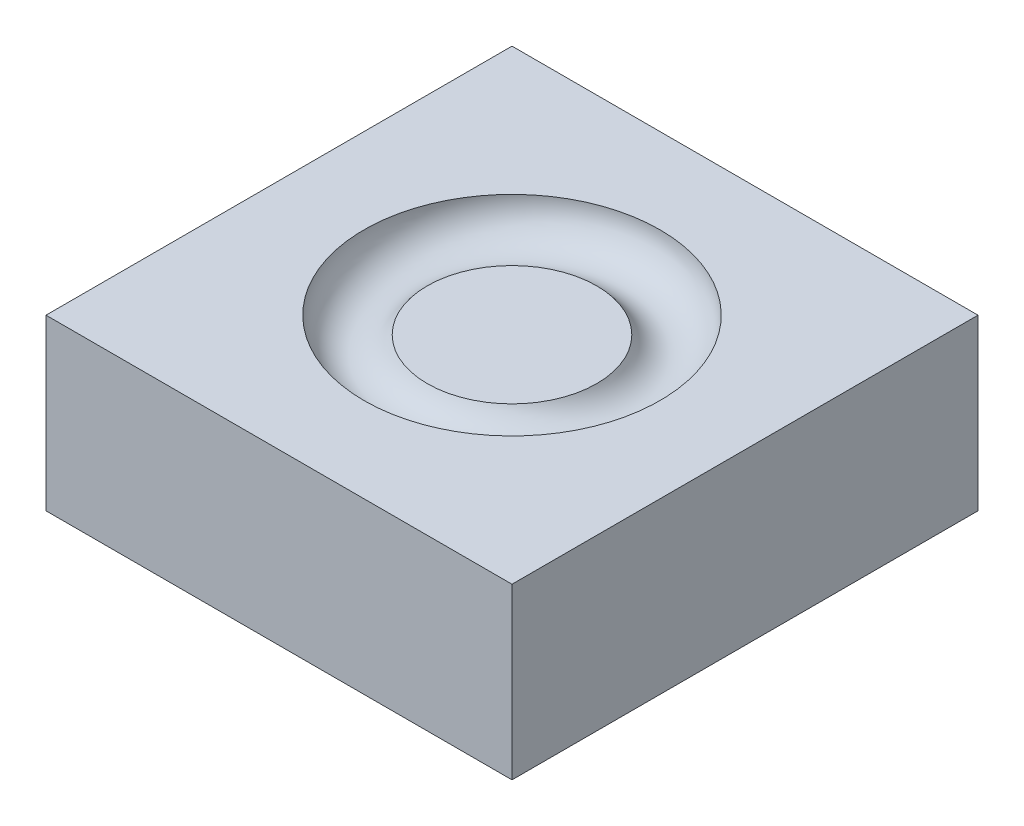
ISO-10303-21;
HEADER;
FILE_DESCRIPTION(('STEP AP214'),'2;1');
FILE_NAME('part.step','',(''),(''),'','','');
FILE_SCHEMA(('AUTOMOTIVE_DESIGN { 1 0 10303 214 1 1 1 1 }'));
ENDSEC;
DATA;
#1=APPLICATION_CONTEXT('core data for automotive mechanical design processes');
#2=APPLICATION_PROTOCOL_DEFINITION('international standard','automotive_design',2000,#1);
#3=PRODUCT_CONTEXT('',#1,'mechanical');
#4=PRODUCT('Part','Part','',(#3));
#5=PRODUCT_RELATED_PRODUCT_CATEGORY('part','',(#4));
#6=PRODUCT_DEFINITION_FORMATION('','',#4);
#7=PRODUCT_DEFINITION_CONTEXT('part definition',#1,'design');
#8=PRODUCT_DEFINITION('design','',#6,#7);
#9=PRODUCT_DEFINITION_SHAPE('','',#8);
#10=(LENGTH_UNIT() NAMED_UNIT(*) SI_UNIT(.MILLI.,.METRE.));
#11=(NAMED_UNIT(*) PLANE_ANGLE_UNIT() SI_UNIT($,.RADIAN.));
#12=(NAMED_UNIT(*) SI_UNIT($,.STERADIAN.) SOLID_ANGLE_UNIT());
#13=UNCERTAINTY_MEASURE_WITH_UNIT(LENGTH_MEASURE(1.E-05),#10,'distance_accuracy_value','');
#14=(GEOMETRIC_REPRESENTATION_CONTEXT(3) GLOBAL_UNCERTAINTY_ASSIGNED_CONTEXT((#13)) GLOBAL_UNIT_ASSIGNED_CONTEXT((#10,
#11,#12)) REPRESENTATION_CONTEXT('',''));
#15=CARTESIAN_POINT('',(0.,0.,0.));
#16=DIRECTION('',(0.,0.,1.));
#17=DIRECTION('',(1.,0.,0.));
#18=AXIS2_PLACEMENT_3D('',#15,#16,#17);
#19=CARTESIAN_POINT('',(0.,0.,0.));
#20=DIRECTION('',(0.,1.,0.));
#21=DIRECTION('',(0.,0.,1.));
#22=AXIS2_PLACEMENT_3D('',#19,#20,#21);
#23=PLANE('',#22);
#24=CARTESIAN_POINT('',(0.,0.,0.));
#25=DIRECTION('',(0.,-1.,0.));
#26=DIRECTION('',(0.,0.,-1.));
#27=AXIS2_PLACEMENT_3D('',#24,#25,#26);
#28=CIRCLE('',#27,20.);
#29=CARTESIAN_POINT('',(0.,0.,-20.));
#30=VERTEX_POINT('',#29);
#31=EDGE_CURVE('E124',#30,#30,#28,.T.);
#32=ORIENTED_EDGE('',*,*,#31,.F.);
#33=EDGE_LOOP('',(#32));
#34=FACE_BOUND('',#33,.T.);
#35=ADVANCED_FACE('F46',(#34),#23,.T.);
#36=CARTESIAN_POINT('',(0.,4.,0.));
#37=DIRECTION('',(0.,-1.,0.));
#38=DIRECTION('',(0.,0.,-1.));
#39=AXIS2_PLACEMENT_3D('',#36,#37,#38);
#40=TOROIDAL_SURFACE('',#39,26.9282032302755,8.);
#41=ORIENTED_EDGE('',*,*,#31,.T.);
#42=EDGE_LOOP('',(#41));
#43=FACE_BOUND('',#42,.T.);
#44=CARTESIAN_POINT('',(0.,4.,0.));
#45=DIRECTION('',(0.,-1.,0.));
#46=DIRECTION('',(0.,0.,-1.));
#47=AXIS2_PLACEMENT_3D('',#44,#45,#46);
#48=CIRCLE('',#47,34.9282032302755);
#49=CARTESIAN_POINT('',(0.,4.,-34.9282032302755));
#50=VERTEX_POINT('',#49);
#51=EDGE_CURVE('E117',#50,#50,#48,.T.);
#52=ORIENTED_EDGE('',*,*,#51,.F.);
#53=EDGE_LOOP('',(#52));
#54=FACE_BOUND('',#53,.T.);
#55=ADVANCED_FACE('F153',(#43,#54),#40,.F.);
#56=CARTESIAN_POINT('',(-0.725366670454234,4.,-34.9282043037022));
#57=DIRECTION('',(0.,1.,0.));
#58=DIRECTION('',(0.999999999998905,0.,1.47984011281865E-06));
#59=AXIS2_PLACEMENT_3D('',#56,#57,#58);
#60=PLANE('',#59);
#61=DIRECTION('',(0.,0.,1.));
#62=VECTOR('',#61,1.);
#63=CARTESIAN_POINT('',(55.,4.,-55.));
#64=LINE('',#63,#62);
#65=CARTESIAN_POINT('',(55.,4.,-55.));
#66=VERTEX_POINT('',#65);
#67=CARTESIAN_POINT('',(55.,3.99999999999999,55.));
#68=VERTEX_POINT('',#67);
#69=EDGE_CURVE('E58',#66,#68,#64,.T.);
#70=ORIENTED_EDGE('',*,*,#69,.F.);
#71=DIRECTION('',(1.,0.,0.));
#72=VECTOR('',#71,1.);
#73=CARTESIAN_POINT('',(-55.,4.,-55.));
#74=LINE('',#73,#72);
#75=CARTESIAN_POINT('',(-55.,4.,-55.));
#76=VERTEX_POINT('',#75);
#77=EDGE_CURVE('E81',#76,#66,#74,.T.);
#78=ORIENTED_EDGE('',*,*,#77,.F.);
#79=DIRECTION('',(0.,0.,-1.));
#80=VECTOR('',#79,1.);
#81=CARTESIAN_POINT('',(-55.,4.,-55.));
#82=LINE('',#81,#80);
#83=CARTESIAN_POINT('',(-55.,3.99999999999999,55.));
#84=VERTEX_POINT('',#83);
#85=EDGE_CURVE('E86',#84,#76,#82,.T.);
#86=ORIENTED_EDGE('',*,*,#85,.F.);
#87=DIRECTION('',(-1.,0.,0.));
#88=VECTOR('',#87,1.);
#89=CARTESIAN_POINT('',(-55.,3.99999999999999,55.));
#90=LINE('',#89,#88);
#91=EDGE_CURVE('E101',#68,#84,#90,.T.);
#92=ORIENTED_EDGE('',*,*,#91,.F.);
#93=EDGE_LOOP('',(#70,#78,#86,#92));
#94=FACE_BOUND('',#93,.T.);
#95=ORIENTED_EDGE('',*,*,#51,.T.);
#96=EDGE_LOOP('',(#95));
#97=FACE_BOUND('',#96,.T.);
#98=ADVANCED_FACE('F48',(#94,#97),#60,.T.);
#99=CARTESIAN_POINT('',(0.,-36.,0.));
#100=DIRECTION('',(0.,1.,0.));
#101=DIRECTION('',(0.,0.,1.));
#102=AXIS2_PLACEMENT_3D('',#99,#100,#101);
#103=PLANE('',#102);
#104=DIRECTION('',(0.,0.,1.));
#105=VECTOR('',#104,1.);
#106=CARTESIAN_POINT('',(55.,-36.,-55.));
#107=LINE('',#106,#105);
#108=CARTESIAN_POINT('',(55.,-36.,-55.));
#109=VERTEX_POINT('',#108);
#110=CARTESIAN_POINT('',(55.,-36.,55.));
#111=VERTEX_POINT('',#110);
#112=EDGE_CURVE('E113',#109,#111,#107,.T.);
#113=ORIENTED_EDGE('',*,*,#112,.T.);
#114=DIRECTION('',(-1.,0.,0.));
#115=VECTOR('',#114,1.);
#116=CARTESIAN_POINT('',(-55.,-36.,55.));
#117=LINE('',#116,#115);
#118=CARTESIAN_POINT('',(-55.,-36.,55.));
#119=VERTEX_POINT('',#118);
#120=EDGE_CURVE('E99',#111,#119,#117,.T.);
#121=ORIENTED_EDGE('',*,*,#120,.T.);
#122=DIRECTION('',(0.,0.,-1.));
#123=VECTOR('',#122,1.);
#124=CARTESIAN_POINT('',(-55.,-36.,-55.));
#125=LINE('',#124,#123);
#126=CARTESIAN_POINT('',(-55.,-36.,-55.));
#127=VERTEX_POINT('',#126);
#128=EDGE_CURVE('E104',#119,#127,#125,.T.);
#129=ORIENTED_EDGE('',*,*,#128,.T.);
#130=DIRECTION('',(1.,0.,0.));
#131=VECTOR('',#130,1.);
#132=CARTESIAN_POINT('',(-55.,-36.,-55.));
#133=LINE('',#132,#131);
#134=EDGE_CURVE('E110',#127,#109,#133,.T.);
#135=ORIENTED_EDGE('',*,*,#134,.T.);
#136=EDGE_LOOP('',(#113,#121,#129,#135));
#137=FACE_BOUND('',#136,.T.);
#138=ADVANCED_FACE('F112',(#137),#103,.F.);
#139=CARTESIAN_POINT('',(-55.,44.,55.));
#140=DIRECTION('',(0.,0.,1.));
#141=DIRECTION('',(1.,0.,0.));
#142=AXIS2_PLACEMENT_3D('',#139,#140,#141);
#143=PLANE('',#142);
#144=DIRECTION('',(0.,-1.,0.));
#145=VECTOR('',#144,1.);
#146=CARTESIAN_POINT('',(55.,44.,55.));
#147=LINE('',#146,#145);
#148=EDGE_CURVE('E11',#68,#111,#147,.T.);
#149=ORIENTED_EDGE('',*,*,#148,.F.);
#150=ORIENTED_EDGE('',*,*,#91,.T.);
#151=DIRECTION('',(0.,-1.,0.));
#152=VECTOR('',#151,1.);
#153=CARTESIAN_POINT('',(-55.,44.,55.));
#154=LINE('',#153,#152);
#155=EDGE_CURVE('E96',#84,#119,#154,.T.);
#156=ORIENTED_EDGE('',*,*,#155,.T.);
#157=ORIENTED_EDGE('',*,*,#120,.F.);
#158=EDGE_LOOP('',(#149,#150,#156,#157));
#159=FACE_BOUND('',#158,.T.);
#160=ADVANCED_FACE('F97',(#159),#143,.T.);
#161=CARTESIAN_POINT('',(-55.,44.,-55.));
#162=DIRECTION('',(-1.,0.,0.));
#163=DIRECTION('',(0.,0.,1.));
#164=AXIS2_PLACEMENT_3D('',#161,#162,#163);
#165=PLANE('',#164);
#166=ORIENTED_EDGE('',*,*,#155,.F.);
#167=ORIENTED_EDGE('',*,*,#85,.T.);
#168=DIRECTION('',(0.,-1.,0.));
#169=VECTOR('',#168,1.);
#170=CARTESIAN_POINT('',(-55.,44.,-55.));
#171=LINE('',#170,#169);
#172=EDGE_CURVE('E91',#76,#127,#171,.T.);
#173=ORIENTED_EDGE('',*,*,#172,.T.);
#174=ORIENTED_EDGE('',*,*,#128,.F.);
#175=EDGE_LOOP('',(#166,#167,#173,#174));
#176=FACE_BOUND('',#175,.T.);
#177=ADVANCED_FACE('F105',(#176),#165,.T.);
#178=CARTESIAN_POINT('',(-55.,44.,-55.));
#179=DIRECTION('',(0.,0.,-1.));
#180=DIRECTION('',(-1.,0.,0.));
#181=AXIS2_PLACEMENT_3D('',#178,#179,#180);
#182=PLANE('',#181);
#183=ORIENTED_EDGE('',*,*,#172,.F.);
#184=ORIENTED_EDGE('',*,*,#77,.T.);
#185=DIRECTION('',(0.,-1.,0.));
#186=VECTOR('',#185,1.);
#187=CARTESIAN_POINT('',(55.,44.,-55.));
#188=LINE('',#187,#186);
#189=EDGE_CURVE('E132',#66,#109,#188,.T.);
#190=ORIENTED_EDGE('',*,*,#189,.T.);
#191=ORIENTED_EDGE('',*,*,#134,.F.);
#192=EDGE_LOOP('',(#183,#184,#190,#191));
#193=FACE_BOUND('',#192,.T.);
#194=ADVANCED_FACE('F142',(#193),#182,.T.);
#195=CARTESIAN_POINT('',(55.,44.,-55.));
#196=DIRECTION('',(1.,0.,0.));
#197=DIRECTION('',(0.,0.,-1.));
#198=AXIS2_PLACEMENT_3D('',#195,#196,#197);
#199=PLANE('',#198);
#200=ORIENTED_EDGE('',*,*,#189,.F.);
#201=ORIENTED_EDGE('',*,*,#69,.T.);
#202=ORIENTED_EDGE('',*,*,#148,.T.);
#203=ORIENTED_EDGE('',*,*,#112,.F.);
#204=EDGE_LOOP('',(#200,#201,#202,#203));
#205=FACE_BOUND('',#204,.T.);
#206=ADVANCED_FACE('F144',(#205),#199,.T.);
#207=CLOSED_SHELL('',(#35,#55,#98,#138,#160,#177,#194,#206));
#208=MANIFOLD_SOLID_BREP('B2',#207);
#209=ADVANCED_BREP_SHAPE_REPRESENTATION('',(#18,#208),#14);
#210=SHAPE_DEFINITION_REPRESENTATION(#9,#209);
ENDSEC;
END-ISO-10303-21;
